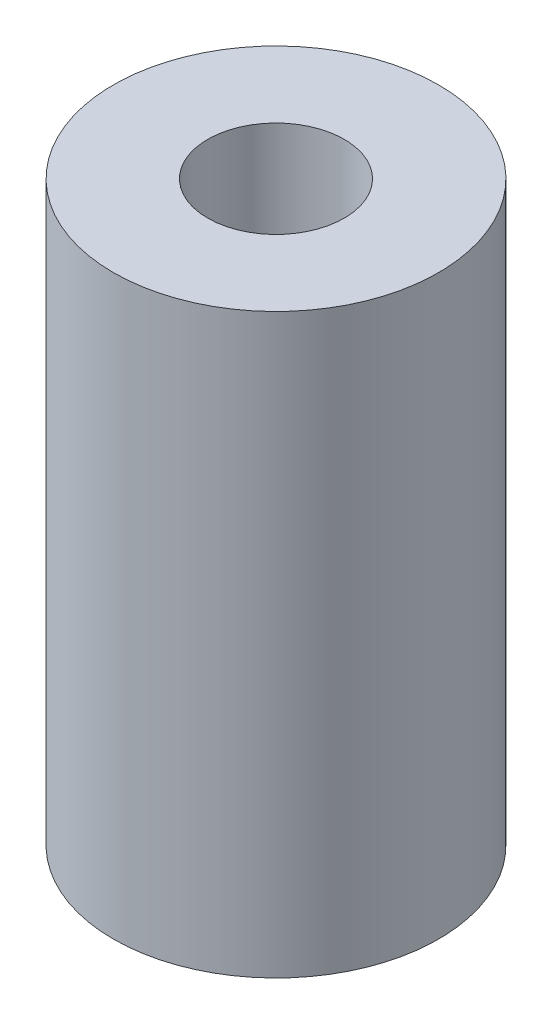
ISO-10303-21;
HEADER;
FILE_DESCRIPTION(('STEP AP214'),'2;1');
FILE_NAME('part.step','',(''),(''),'','','');
FILE_SCHEMA(('AUTOMOTIVE_DESIGN { 1 0 10303 214 1 1 1 1 }'));
ENDSEC;
DATA;
#1=APPLICATION_CONTEXT('core data for automotive mechanical design processes');
#2=APPLICATION_PROTOCOL_DEFINITION('international standard','automotive_design',2000,#1);
#3=PRODUCT_CONTEXT('',#1,'mechanical');
#4=PRODUCT('Part','Part','',(#3));
#5=PRODUCT_RELATED_PRODUCT_CATEGORY('part','',(#4));
#6=PRODUCT_DEFINITION_FORMATION('','',#4);
#7=PRODUCT_DEFINITION_CONTEXT('part definition',#1,'design');
#8=PRODUCT_DEFINITION('design','',#6,#7);
#9=PRODUCT_DEFINITION_SHAPE('','',#8);
#10=(LENGTH_UNIT() NAMED_UNIT(*) SI_UNIT(.MILLI.,.METRE.));
#11=(NAMED_UNIT(*) PLANE_ANGLE_UNIT() SI_UNIT($,.RADIAN.));
#12=(NAMED_UNIT(*) SI_UNIT($,.STERADIAN.) SOLID_ANGLE_UNIT());
#13=UNCERTAINTY_MEASURE_WITH_UNIT(LENGTH_MEASURE(1.E-05),#10,'distance_accuracy_value','');
#14=(GEOMETRIC_REPRESENTATION_CONTEXT(3) GLOBAL_UNCERTAINTY_ASSIGNED_CONTEXT((#13)) GLOBAL_UNIT_ASSIGNED_CONTEXT((#10,
#11,#12)) REPRESENTATION_CONTEXT('',''));
#15=CARTESIAN_POINT('',(0.,0.,0.));
#16=DIRECTION('',(0.,0.,1.));
#17=DIRECTION('',(1.,0.,0.));
#18=AXIS2_PLACEMENT_3D('',#15,#16,#17);
#19=CARTESIAN_POINT('',(0.,17.75,0.));
#20=DIRECTION('',(0.,1.,0.));
#21=DIRECTION('',(0.,0.,1.));
#22=AXIS2_PLACEMENT_3D('',#19,#20,#21);
#23=PLANE('',#22);
#24=CARTESIAN_POINT('',(0.,17.75,0.));
#25=DIRECTION('',(0.,1.,0.));
#26=DIRECTION('',(0.,0.,1.));
#27=AXIS2_PLACEMENT_3D('',#24,#25,#26);
#28=CIRCLE('',#27,5.);
#29=CARTESIAN_POINT('',(0.,17.75,5.));
#30=VERTEX_POINT('',#29);
#31=EDGE_CURVE('E10',#30,#30,#28,.T.);
#32=ORIENTED_EDGE('',*,*,#31,.T.);
#33=EDGE_LOOP('',(#32));
#34=FACE_BOUND('',#33,.T.);
#35=CARTESIAN_POINT('',(0.,17.75,0.));
#36=DIRECTION('',(0.,1.,0.));
#37=DIRECTION('',(0.,0.,1.));
#38=AXIS2_PLACEMENT_3D('',#35,#36,#37);
#39=CIRCLE('',#38,2.1);
#40=CARTESIAN_POINT('',(0.,17.75,2.1));
#41=VERTEX_POINT('',#40);
#42=EDGE_CURVE('E44',#41,#41,#39,.T.);
#43=ORIENTED_EDGE('',*,*,#42,.F.);
#44=EDGE_LOOP('',(#43));
#45=FACE_BOUND('',#44,.T.);
#46=ADVANCED_FACE('F33',(#34,#45),#23,.T.);
#47=CARTESIAN_POINT('',(0.,0.,0.));
#48=DIRECTION('',(0.,1.,0.));
#49=DIRECTION('',(0.,0.,1.));
#50=AXIS2_PLACEMENT_3D('',#47,#48,#49);
#51=PLANE('',#50);
#52=CARTESIAN_POINT('',(0.,0.,0.));
#53=DIRECTION('',(0.,1.,0.));
#54=DIRECTION('',(0.,0.,1.));
#55=AXIS2_PLACEMENT_3D('',#52,#53,#54);
#56=CIRCLE('',#55,5.);
#57=CARTESIAN_POINT('',(0.,0.,5.));
#58=VERTEX_POINT('',#57);
#59=EDGE_CURVE('E37',#58,#58,#56,.T.);
#60=ORIENTED_EDGE('',*,*,#59,.F.);
#61=EDGE_LOOP('',(#60));
#62=FACE_BOUND('',#61,.T.);
#63=CARTESIAN_POINT('',(0.,0.,0.));
#64=DIRECTION('',(0.,1.,0.));
#65=DIRECTION('',(0.,0.,1.));
#66=AXIS2_PLACEMENT_3D('',#63,#64,#65);
#67=CIRCLE('',#66,2.1);
#68=CARTESIAN_POINT('',(0.,0.,2.1));
#69=VERTEX_POINT('',#68);
#70=EDGE_CURVE('E46',#69,#69,#67,.T.);
#71=ORIENTED_EDGE('',*,*,#70,.T.);
#72=EDGE_LOOP('',(#71));
#73=FACE_BOUND('',#72,.T.);
#74=ADVANCED_FACE('F56',(#62,#73),#51,.F.);
#75=CARTESIAN_POINT('',(0.,17.75,0.));
#76=DIRECTION('',(0.,-1.,0.));
#77=DIRECTION('',(0.,0.,-1.));
#78=AXIS2_PLACEMENT_3D('',#75,#76,#77);
#79=CYLINDRICAL_SURFACE('',#78,5.);
#80=ORIENTED_EDGE('',*,*,#31,.F.);
#81=EDGE_LOOP('',(#80));
#82=FACE_BOUND('',#81,.T.);
#83=ORIENTED_EDGE('',*,*,#59,.T.);
#84=EDGE_LOOP('',(#83));
#85=FACE_BOUND('',#84,.T.);
#86=ADVANCED_FACE('F35',(#82,#85),#79,.T.);
#87=CARTESIAN_POINT('',(0.,17.75,0.));
#88=DIRECTION('',(0.,-1.,0.));
#89=DIRECTION('',(0.,0.,-1.));
#90=AXIS2_PLACEMENT_3D('',#87,#88,#89);
#91=CYLINDRICAL_SURFACE('',#90,2.1);
#92=ORIENTED_EDGE('',*,*,#42,.T.);
#93=EDGE_LOOP('',(#92));
#94=FACE_BOUND('',#93,.T.);
#95=ORIENTED_EDGE('',*,*,#70,.F.);
#96=EDGE_LOOP('',(#95));
#97=FACE_BOUND('',#96,.T.);
#98=ADVANCED_FACE('F52',(#94,#97),#91,.F.);
#99=CLOSED_SHELL('',(#46,#74,#86,#98));
#100=MANIFOLD_SOLID_BREP('B2',#99);
#101=ADVANCED_BREP_SHAPE_REPRESENTATION('',(#18,#100),#14);
#102=SHAPE_DEFINITION_REPRESENTATION(#9,#101);
ENDSEC;
END-ISO-10303-21;
